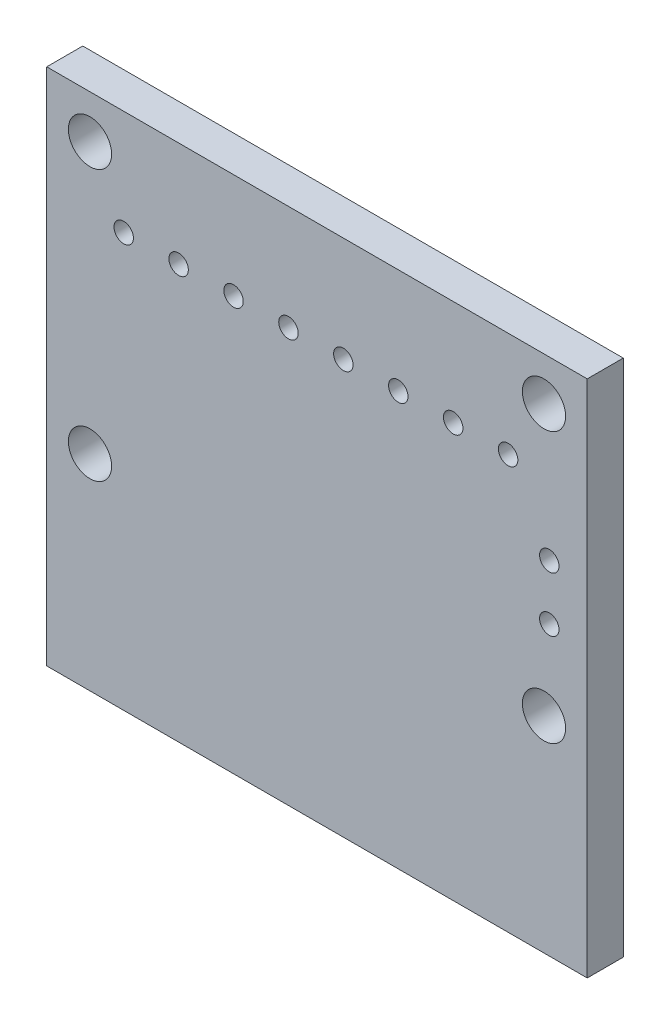
ISO-10303-21;
HEADER;
FILE_DESCRIPTION(('STEP AP214'),'2;1');
FILE_NAME('part.step','',(''),(''),'','','');
FILE_SCHEMA(('AUTOMOTIVE_DESIGN { 1 0 10303 214 1 1 1 1 }'));
ENDSEC;
DATA;
#1=APPLICATION_CONTEXT('core data for automotive mechanical design processes');
#2=APPLICATION_PROTOCOL_DEFINITION('international standard','automotive_design',2000,#1);
#3=PRODUCT_CONTEXT('',#1,'mechanical');
#4=PRODUCT('Part','Part','',(#3));
#5=PRODUCT_RELATED_PRODUCT_CATEGORY('part','',(#4));
#6=PRODUCT_DEFINITION_FORMATION('','',#4);
#7=PRODUCT_DEFINITION_CONTEXT('part definition',#1,'design');
#8=PRODUCT_DEFINITION('design','',#6,#7);
#9=PRODUCT_DEFINITION_SHAPE('','',#8);
#10=(LENGTH_UNIT() NAMED_UNIT(*) SI_UNIT(.MILLI.,.METRE.));
#11=(NAMED_UNIT(*) PLANE_ANGLE_UNIT() SI_UNIT($,.RADIAN.));
#12=(NAMED_UNIT(*) SI_UNIT($,.STERADIAN.) SOLID_ANGLE_UNIT());
#13=UNCERTAINTY_MEASURE_WITH_UNIT(LENGTH_MEASURE(1.E-05),#10,'distance_accuracy_value','');
#14=(GEOMETRIC_REPRESENTATION_CONTEXT(3) GLOBAL_UNCERTAINTY_ASSIGNED_CONTEXT((#13)) GLOBAL_UNIT_ASSIGNED_CONTEXT((#10,
#11,#12)) REPRESENTATION_CONTEXT('',''));
#15=CARTESIAN_POINT('',(0.,0.,0.));
#16=DIRECTION('',(0.,0.,1.));
#17=DIRECTION('',(1.,0.,0.));
#18=AXIS2_PLACEMENT_3D('',#15,#16,#17);
#19=CARTESIAN_POINT('',(31.9999995,37.5000012,1.66624));
#20=DIRECTION('',(0.,0.,-1.));
#21=DIRECTION('',(-1.,0.,0.));
#22=AXIS2_PLACEMENT_3D('',#19,#20,#21);
#23=PLANE('',#22);
#24=CARTESIAN_POINT('',(54.9999916,59.500008,1.66624));
#25=DIRECTION('',(0.,0.,-1.));
#26=DIRECTION('',(-1.,0.,0.));
#27=AXIS2_PLACEMENT_3D('',#24,#25,#26);
#28=CIRCLE('',#27,1.00000054);
#29=CARTESIAN_POINT('',(53.99999106,59.500008,1.66624));
#30=VERTEX_POINT('',#29);
#31=EDGE_CURVE('E120',#30,#30,#28,.T.);
#32=ORIENTED_EDGE('',*,*,#31,.T.);
#33=EDGE_LOOP('',(#32));
#34=FACE_BOUND('',#33,.T.);
#35=CARTESIAN_POINT('',(53.34,56.642,1.66624));
#36=DIRECTION('',(0.,0.,-1.));
#37=DIRECTION('',(-1.,0.,0.));
#38=AXIS2_PLACEMENT_3D('',#35,#36,#37);
#39=CIRCLE('',#38,0.4499991);
#40=CARTESIAN_POINT('',(52.8900009,56.642,1.66624));
#41=VERTEX_POINT('',#40);
#42=EDGE_CURVE('E124',#41,#41,#39,.T.);
#43=ORIENTED_EDGE('',*,*,#42,.T.);
#44=EDGE_LOOP('',(#43));
#45=FACE_BOUND('',#44,.T.);
#46=CARTESIAN_POINT('',(48.26,56.642,1.66624));
#47=DIRECTION('',(0.,0.,-1.));
#48=DIRECTION('',(-1.,0.,0.));
#49=AXIS2_PLACEMENT_3D('',#46,#47,#48);
#50=CIRCLE('',#49,0.4499991);
#51=CARTESIAN_POINT('',(47.8100009,56.642,1.66624));
#52=VERTEX_POINT('',#51);
#53=EDGE_CURVE('E127',#52,#52,#50,.T.);
#54=ORIENTED_EDGE('',*,*,#53,.T.);
#55=EDGE_LOOP('',(#54));
#56=FACE_BOUND('',#55,.T.);
#57=CARTESIAN_POINT('',(50.8,56.642,1.66624));
#58=DIRECTION('',(0.,0.,-1.));
#59=DIRECTION('',(-1.,0.,0.));
#60=AXIS2_PLACEMENT_3D('',#57,#58,#59);
#61=CIRCLE('',#60,0.4499991);
#62=CARTESIAN_POINT('',(50.3500009,56.642,1.66624));
#63=VERTEX_POINT('',#62);
#64=EDGE_CURVE('E130',#63,#63,#61,.T.);
#65=ORIENTED_EDGE('',*,*,#64,.T.);
#66=EDGE_LOOP('',(#65));
#67=FACE_BOUND('',#66,.T.);
#68=CARTESIAN_POINT('',(55.245,50.8,1.66624));
#69=DIRECTION('',(0.,0.,-1.));
#70=DIRECTION('',(-1.,0.,0.));
#71=AXIS2_PLACEMENT_3D('',#68,#69,#70);
#72=CIRCLE('',#71,0.4499991);
#73=CARTESIAN_POINT('',(54.7950009,50.8,1.66624));
#74=VERTEX_POINT('',#73);
#75=EDGE_CURVE('E133',#74,#74,#72,.T.);
#76=ORIENTED_EDGE('',*,*,#75,.T.);
#77=EDGE_LOOP('',(#76));
#78=FACE_BOUND('',#77,.T.);
#79=CARTESIAN_POINT('',(54.9999916,47.0000076,1.66624));
#80=DIRECTION('',(0.,0.,-1.));
#81=DIRECTION('',(-1.,0.,0.));
#82=AXIS2_PLACEMENT_3D('',#79,#80,#81);
#83=CIRCLE('',#82,1.00000054);
#84=CARTESIAN_POINT('',(53.99999106,47.0000076,1.66624));
#85=VERTEX_POINT('',#84);
#86=EDGE_CURVE('E136',#85,#85,#83,.T.);
#87=ORIENTED_EDGE('',*,*,#86,.T.);
#88=EDGE_LOOP('',(#87));
#89=FACE_BOUND('',#88,.T.);
#90=CARTESIAN_POINT('',(55.245,53.34,1.66624));
#91=DIRECTION('',(0.,0.,-1.));
#92=DIRECTION('',(-1.,0.,0.));
#93=AXIS2_PLACEMENT_3D('',#90,#91,#92);
#94=CIRCLE('',#93,0.4499991);
#95=CARTESIAN_POINT('',(54.7950009,53.34,1.66624));
#96=VERTEX_POINT('',#95);
#97=EDGE_CURVE('E139',#96,#96,#94,.T.);
#98=ORIENTED_EDGE('',*,*,#97,.T.);
#99=EDGE_LOOP('',(#98));
#100=FACE_BOUND('',#99,.T.);
#101=CARTESIAN_POINT('',(43.18,56.642,1.66624));
#102=DIRECTION('',(0.,0.,-1.));
#103=DIRECTION('',(-1.,0.,0.));
#104=AXIS2_PLACEMENT_3D('',#101,#102,#103);
#105=CIRCLE('',#104,0.4499991);
#106=CARTESIAN_POINT('',(42.7300009,56.642,1.66624));
#107=VERTEX_POINT('',#106);
#108=EDGE_CURVE('E142',#107,#107,#105,.T.);
#109=ORIENTED_EDGE('',*,*,#108,.T.);
#110=EDGE_LOOP('',(#109));
#111=FACE_BOUND('',#110,.T.);
#112=CARTESIAN_POINT('',(45.72,56.642,1.66624));
#113=DIRECTION('',(0.,0.,-1.));
#114=DIRECTION('',(-1.,0.,0.));
#115=AXIS2_PLACEMENT_3D('',#112,#113,#114);
#116=CIRCLE('',#115,0.4499991);
#117=CARTESIAN_POINT('',(45.2700009,56.642,1.66624));
#118=VERTEX_POINT('',#117);
#119=EDGE_CURVE('E145',#118,#118,#116,.T.);
#120=ORIENTED_EDGE('',*,*,#119,.T.);
#121=EDGE_LOOP('',(#120));
#122=FACE_BOUND('',#121,.T.);
#123=CARTESIAN_POINT('',(33.9999828,59.500008,1.66624));
#124=DIRECTION('',(0.,0.,-1.));
#125=DIRECTION('',(-1.,0.,0.));
#126=AXIS2_PLACEMENT_3D('',#123,#124,#125);
#127=CIRCLE('',#126,1.00000054);
#128=CARTESIAN_POINT('',(32.99998226,59.500008,1.66624));
#129=VERTEX_POINT('',#128);
#130=EDGE_CURVE('E148',#129,#129,#127,.T.);
#131=ORIENTED_EDGE('',*,*,#130,.T.);
#132=EDGE_LOOP('',(#131));
#133=FACE_BOUND('',#132,.T.);
#134=CARTESIAN_POINT('',(40.64,56.642,1.66624));
#135=DIRECTION('',(0.,0.,-1.));
#136=DIRECTION('',(-1.,0.,0.));
#137=AXIS2_PLACEMENT_3D('',#134,#135,#136);
#138=CIRCLE('',#137,0.4499991);
#139=CARTESIAN_POINT('',(40.1900009,56.642,1.66624));
#140=VERTEX_POINT('',#139);
#141=EDGE_CURVE('E151',#140,#140,#138,.T.);
#142=ORIENTED_EDGE('',*,*,#141,.T.);
#143=EDGE_LOOP('',(#142));
#144=FACE_BOUND('',#143,.T.);
#145=CARTESIAN_POINT('',(35.56,56.642,1.66624));
#146=DIRECTION('',(0.,0.,-1.));
#147=DIRECTION('',(-1.,0.,0.));
#148=AXIS2_PLACEMENT_3D('',#145,#146,#147);
#149=CIRCLE('',#148,0.4499991);
#150=CARTESIAN_POINT('',(35.1100009,56.642,1.66624));
#151=VERTEX_POINT('',#150);
#152=EDGE_CURVE('E154',#151,#151,#149,.T.);
#153=ORIENTED_EDGE('',*,*,#152,.T.);
#154=EDGE_LOOP('',(#153));
#155=FACE_BOUND('',#154,.T.);
#156=CARTESIAN_POINT('',(38.1,56.642,1.66624));
#157=DIRECTION('',(0.,0.,-1.));
#158=DIRECTION('',(-1.,0.,0.));
#159=AXIS2_PLACEMENT_3D('',#156,#157,#158);
#160=CIRCLE('',#159,0.4499991);
#161=CARTESIAN_POINT('',(37.6500009,56.642,1.66624));
#162=VERTEX_POINT('',#161);
#163=EDGE_CURVE('E156',#162,#162,#160,.T.);
#164=ORIENTED_EDGE('',*,*,#163,.T.);
#165=EDGE_LOOP('',(#164));
#166=FACE_BOUND('',#165,.T.);
#167=CARTESIAN_POINT('',(33.9999828,47.0000076,1.66624));
#168=DIRECTION('',(0.,0.,-1.));
#169=DIRECTION('',(-1.,0.,0.));
#170=AXIS2_PLACEMENT_3D('',#167,#168,#169);
#171=CIRCLE('',#170,1.00000054);
#172=CARTESIAN_POINT('',(32.99998226,47.0000076,1.66624));
#173=VERTEX_POINT('',#172);
#174=EDGE_CURVE('E19',#173,#173,#171,.T.);
#175=ORIENTED_EDGE('',*,*,#174,.T.);
#176=EDGE_LOOP('',(#175));
#177=FACE_BOUND('',#176,.T.);
#178=DIRECTION('',(0.,1.,0.));
#179=VECTOR('',#178,1.);
#180=CARTESIAN_POINT('',(57.0000003,37.5000012,1.66624));
#181=LINE('',#180,#179);
#182=CARTESIAN_POINT('',(57.0000003,37.5000012,1.66624));
#183=VERTEX_POINT('',#182);
#184=CARTESIAN_POINT('',(57.0000003,61.49999892,1.66624));
#185=VERTEX_POINT('',#184);
#186=EDGE_CURVE('E54',#183,#185,#181,.T.);
#187=ORIENTED_EDGE('',*,*,#186,.T.);
#188=DIRECTION('',(1.,0.,0.));
#189=VECTOR('',#188,1.);
#190=CARTESIAN_POINT('',(57.0000003,61.49999892,1.66624));
#191=LINE('',#190,#189);
#192=CARTESIAN_POINT('',(31.9999995,61.49999892,1.66624));
#193=VERTEX_POINT('',#192);
#194=EDGE_CURVE('E56',#185,#193,#191,.F.);
#195=ORIENTED_EDGE('',*,*,#194,.T.);
#196=DIRECTION('',(0.,1.,0.));
#197=VECTOR('',#196,1.);
#198=CARTESIAN_POINT('',(31.9999995,61.49999892,1.66624));
#199=LINE('',#198,#197);
#200=CARTESIAN_POINT('',(31.9999995,37.5000012,1.66624));
#201=VERTEX_POINT('',#200);
#202=EDGE_CURVE('E58',#193,#201,#199,.F.);
#203=ORIENTED_EDGE('',*,*,#202,.T.);
#204=DIRECTION('',(1.,0.,0.));
#205=VECTOR('',#204,1.);
#206=CARTESIAN_POINT('',(31.9999995,37.5000012,1.66624));
#207=LINE('',#206,#205);
#208=EDGE_CURVE('E163',#201,#183,#207,.T.);
#209=ORIENTED_EDGE('',*,*,#208,.T.);
#210=EDGE_LOOP('',(#187,#195,#203,#209));
#211=FACE_BOUND('',#210,.T.);
#212=ADVANCED_FACE('F16',(#34,#45,#56,#67,#78,#89,#100,#111,#122,#133,#144,#155,#166,#177,#211),
#23,.F.);
#213=CARTESIAN_POINT('',(31.9999995,61.49999892,0.));
#214=DIRECTION('',(1.,0.,0.));
#215=DIRECTION('',(0.,0.,-1.));
#216=AXIS2_PLACEMENT_3D('',#213,#214,#215);
#217=PLANE('',#216);
#218=DIRECTION('',(0.,0.,1.));
#219=VECTOR('',#218,1.);
#220=CARTESIAN_POINT('',(31.9999995,37.5000012,0.));
#221=LINE('',#220,#219);
#222=CARTESIAN_POINT('',(31.9999995,37.5000012,0.));
#223=VERTEX_POINT('',#222);
#224=EDGE_CURVE('E69',#223,#201,#221,.T.);
#225=ORIENTED_EDGE('',*,*,#224,.T.);
#226=ORIENTED_EDGE('',*,*,#202,.F.);
#227=DIRECTION('',(0.,0.,-1.));
#228=VECTOR('',#227,1.);
#229=CARTESIAN_POINT('',(31.9999995,61.49999892,0.));
#230=LINE('',#229,#228);
#231=CARTESIAN_POINT('',(31.9999995,61.49999892,0.));
#232=VERTEX_POINT('',#231);
#233=EDGE_CURVE('E63',#193,#232,#230,.T.);
#234=ORIENTED_EDGE('',*,*,#233,.T.);
#235=DIRECTION('',(0.,1.,0.));
#236=VECTOR('',#235,1.);
#237=CARTESIAN_POINT('',(31.9999995,37.5000012,0.));
#238=LINE('',#237,#236);
#239=EDGE_CURVE('E123',#223,#232,#238,.T.);
#240=ORIENTED_EDGE('',*,*,#239,.F.);
#241=EDGE_LOOP('',(#225,#226,#234,#240));
#242=FACE_BOUND('',#241,.T.);
#243=ADVANCED_FACE('F66',(#242),#217,.F.);
#244=CARTESIAN_POINT('',(57.0000003,61.49999892,0.));
#245=DIRECTION('',(0.,-1.,0.));
#246=DIRECTION('',(0.,0.,-1.));
#247=AXIS2_PLACEMENT_3D('',#244,#245,#246);
#248=PLANE('',#247);
#249=ORIENTED_EDGE('',*,*,#233,.F.);
#250=ORIENTED_EDGE('',*,*,#194,.F.);
#251=DIRECTION('',(0.,0.,1.));
#252=VECTOR('',#251,1.);
#253=CARTESIAN_POINT('',(57.0000003,61.49999892,0.));
#254=LINE('',#253,#252);
#255=CARTESIAN_POINT('',(57.0000003,61.49999892,0.));
#256=VERTEX_POINT('',#255);
#257=EDGE_CURVE('E77',#185,#256,#254,.F.);
#258=ORIENTED_EDGE('',*,*,#257,.T.);
#259=DIRECTION('',(-1.,0.,0.));
#260=VECTOR('',#259,1.);
#261=CARTESIAN_POINT('',(31.9999995,61.49999892,0.));
#262=LINE('',#261,#260);
#263=EDGE_CURVE('E74',#232,#256,#262,.F.);
#264=ORIENTED_EDGE('',*,*,#263,.F.);
#265=EDGE_LOOP('',(#249,#250,#258,#264));
#266=FACE_BOUND('',#265,.T.);
#267=ADVANCED_FACE('F72',(#266),#248,.F.);
#268=CARTESIAN_POINT('',(57.0000003,37.5000012,0.));
#269=DIRECTION('',(-1.,0.,0.));
#270=DIRECTION('',(0.,0.,1.));
#271=AXIS2_PLACEMENT_3D('',#268,#269,#270);
#272=PLANE('',#271);
#273=ORIENTED_EDGE('',*,*,#257,.F.);
#274=ORIENTED_EDGE('',*,*,#186,.F.);
#275=DIRECTION('',(0.,0.,1.));
#276=VECTOR('',#275,1.);
#277=CARTESIAN_POINT('',(57.0000003,37.5000012,0.));
#278=LINE('',#277,#276);
#279=CARTESIAN_POINT('',(57.0000003,37.5000012,0.));
#280=VERTEX_POINT('',#279);
#281=EDGE_CURVE('E34',#183,#280,#278,.F.);
#282=ORIENTED_EDGE('',*,*,#281,.T.);
#283=DIRECTION('',(0.,1.,0.));
#284=VECTOR('',#283,1.);
#285=CARTESIAN_POINT('',(57.0000003,37.5000012,0.));
#286=LINE('',#285,#284);
#287=EDGE_CURVE('E170',#256,#280,#286,.F.);
#288=ORIENTED_EDGE('',*,*,#287,.F.);
#289=EDGE_LOOP('',(#273,#274,#282,#288));
#290=FACE_BOUND('',#289,.T.);
#291=ADVANCED_FACE('F171',(#290),#272,.F.);
#292=CARTESIAN_POINT('',(31.9999995,37.5000012,0.));
#293=DIRECTION('',(0.,1.,0.));
#294=DIRECTION('',(0.,0.,1.));
#295=AXIS2_PLACEMENT_3D('',#292,#293,#294);
#296=PLANE('',#295);
#297=ORIENTED_EDGE('',*,*,#281,.F.);
#298=ORIENTED_EDGE('',*,*,#208,.F.);
#299=ORIENTED_EDGE('',*,*,#224,.F.);
#300=DIRECTION('',(-1.,0.,0.));
#301=VECTOR('',#300,1.);
#302=CARTESIAN_POINT('',(31.9999995,37.5000012,0.));
#303=LINE('',#302,#301);
#304=EDGE_CURVE('E119',#280,#223,#303,.T.);
#305=ORIENTED_EDGE('',*,*,#304,.F.);
#306=EDGE_LOOP('',(#297,#298,#299,#305));
#307=FACE_BOUND('',#306,.T.);
#308=ADVANCED_FACE('F178',(#307),#296,.F.);
#309=CARTESIAN_POINT('',(33.9999828,47.0000076,0.));
#310=DIRECTION('',(0.,0.,-1.));
#311=DIRECTION('',(-1.,0.,0.));
#312=AXIS2_PLACEMENT_3D('',#309,#310,#311);
#313=CYLINDRICAL_SURFACE('',#312,1.00000054);
#314=ORIENTED_EDGE('',*,*,#174,.F.);
#315=EDGE_LOOP('',(#314));
#316=FACE_BOUND('',#315,.T.);
#317=CARTESIAN_POINT('',(33.9999828,47.0000076,0.));
#318=DIRECTION('',(0.,0.,-1.));
#319=DIRECTION('',(-1.,0.,0.));
#320=AXIS2_PLACEMENT_3D('',#317,#318,#319);
#321=CIRCLE('',#320,1.00000054);
#322=CARTESIAN_POINT('',(32.99998226,47.0000076,0.));
#323=VERTEX_POINT('',#322);
#324=EDGE_CURVE('E116',#323,#323,#321,.F.);
#325=ORIENTED_EDGE('',*,*,#324,.F.);
#326=EDGE_LOOP('',(#325));
#327=FACE_BOUND('',#326,.T.);
#328=ADVANCED_FACE('F180',(#316,#327),#313,.F.);
#329=CARTESIAN_POINT('',(38.1,56.642,0.));
#330=DIRECTION('',(0.,0.,-1.));
#331=DIRECTION('',(-1.,0.,0.));
#332=AXIS2_PLACEMENT_3D('',#329,#330,#331);
#333=CYLINDRICAL_SURFACE('',#332,0.4499991);
#334=ORIENTED_EDGE('',*,*,#163,.F.);
#335=EDGE_LOOP('',(#334));
#336=FACE_BOUND('',#335,.T.);
#337=CARTESIAN_POINT('',(38.1,56.642,0.));
#338=DIRECTION('',(0.,0.,-1.));
#339=DIRECTION('',(-1.,0.,0.));
#340=AXIS2_PLACEMENT_3D('',#337,#338,#339);
#341=CIRCLE('',#340,0.4499991);
#342=CARTESIAN_POINT('',(37.6500009,56.642,0.));
#343=VERTEX_POINT('',#342);
#344=EDGE_CURVE('E113',#343,#343,#341,.F.);
#345=ORIENTED_EDGE('',*,*,#344,.F.);
#346=EDGE_LOOP('',(#345));
#347=FACE_BOUND('',#346,.T.);
#348=ADVANCED_FACE('F187',(#336,#347),#333,.F.);
#349=CARTESIAN_POINT('',(35.56,56.642,0.));
#350=DIRECTION('',(0.,0.,-1.));
#351=DIRECTION('',(-1.,0.,0.));
#352=AXIS2_PLACEMENT_3D('',#349,#350,#351);
#353=CYLINDRICAL_SURFACE('',#352,0.4499991);
#354=ORIENTED_EDGE('',*,*,#152,.F.);
#355=EDGE_LOOP('',(#354));
#356=FACE_BOUND('',#355,.T.);
#357=CARTESIAN_POINT('',(35.56,56.642,0.));
#358=DIRECTION('',(0.,0.,-1.));
#359=DIRECTION('',(-1.,0.,0.));
#360=AXIS2_PLACEMENT_3D('',#357,#358,#359);
#361=CIRCLE('',#360,0.4499991);
#362=CARTESIAN_POINT('',(35.1100009,56.642,0.));
#363=VERTEX_POINT('',#362);
#364=EDGE_CURVE('E110',#363,#363,#361,.F.);
#365=ORIENTED_EDGE('',*,*,#364,.F.);
#366=EDGE_LOOP('',(#365));
#367=FACE_BOUND('',#366,.T.);
#368=ADVANCED_FACE('F241',(#356,#367),#353,.F.);
#369=CARTESIAN_POINT('',(40.64,56.642,0.));
#370=DIRECTION('',(0.,0.,-1.));
#371=DIRECTION('',(-1.,0.,0.));
#372=AXIS2_PLACEMENT_3D('',#369,#370,#371);
#373=CYLINDRICAL_SURFACE('',#372,0.4499991);
#374=ORIENTED_EDGE('',*,*,#141,.F.);
#375=EDGE_LOOP('',(#374));
#376=FACE_BOUND('',#375,.T.);
#377=CARTESIAN_POINT('',(40.64,56.642,0.));
#378=DIRECTION('',(0.,0.,-1.));
#379=DIRECTION('',(-1.,0.,0.));
#380=AXIS2_PLACEMENT_3D('',#377,#378,#379);
#381=CIRCLE('',#380,0.4499991);
#382=CARTESIAN_POINT('',(40.1900009,56.642,0.));
#383=VERTEX_POINT('',#382);
#384=EDGE_CURVE('E107',#383,#383,#381,.F.);
#385=ORIENTED_EDGE('',*,*,#384,.F.);
#386=EDGE_LOOP('',(#385));
#387=FACE_BOUND('',#386,.T.);
#388=ADVANCED_FACE('F237',(#376,#387),#373,.F.);
#389=CARTESIAN_POINT('',(33.9999828,59.500008,0.));
#390=DIRECTION('',(0.,0.,-1.));
#391=DIRECTION('',(-1.,0.,0.));
#392=AXIS2_PLACEMENT_3D('',#389,#390,#391);
#393=CYLINDRICAL_SURFACE('',#392,1.00000054);
#394=ORIENTED_EDGE('',*,*,#130,.F.);
#395=EDGE_LOOP('',(#394));
#396=FACE_BOUND('',#395,.T.);
#397=CARTESIAN_POINT('',(33.9999828,59.500008,0.));
#398=DIRECTION('',(0.,0.,-1.));
#399=DIRECTION('',(-1.,0.,0.));
#400=AXIS2_PLACEMENT_3D('',#397,#398,#399);
#401=CIRCLE('',#400,1.00000054);
#402=CARTESIAN_POINT('',(32.99998226,59.500008,0.));
#403=VERTEX_POINT('',#402);
#404=EDGE_CURVE('E104',#403,#403,#401,.F.);
#405=ORIENTED_EDGE('',*,*,#404,.F.);
#406=EDGE_LOOP('',(#405));
#407=FACE_BOUND('',#406,.T.);
#408=ADVANCED_FACE('F233',(#396,#407),#393,.F.);
#409=CARTESIAN_POINT('',(45.72,56.642,0.));
#410=DIRECTION('',(0.,0.,-1.));
#411=DIRECTION('',(-1.,0.,0.));
#412=AXIS2_PLACEMENT_3D('',#409,#410,#411);
#413=CYLINDRICAL_SURFACE('',#412,0.4499991);
#414=ORIENTED_EDGE('',*,*,#119,.F.);
#415=EDGE_LOOP('',(#414));
#416=FACE_BOUND('',#415,.T.);
#417=CARTESIAN_POINT('',(45.72,56.642,0.));
#418=DIRECTION('',(0.,0.,-1.));
#419=DIRECTION('',(-1.,0.,0.));
#420=AXIS2_PLACEMENT_3D('',#417,#418,#419);
#421=CIRCLE('',#420,0.4499991);
#422=CARTESIAN_POINT('',(45.2700009,56.642,0.));
#423=VERTEX_POINT('',#422);
#424=EDGE_CURVE('E101',#423,#423,#421,.F.);
#425=ORIENTED_EDGE('',*,*,#424,.F.);
#426=EDGE_LOOP('',(#425));
#427=FACE_BOUND('',#426,.T.);
#428=ADVANCED_FACE('F229',(#416,#427),#413,.F.);
#429=CARTESIAN_POINT('',(43.18,56.642,0.));
#430=DIRECTION('',(0.,0.,-1.));
#431=DIRECTION('',(-1.,0.,0.));
#432=AXIS2_PLACEMENT_3D('',#429,#430,#431);
#433=CYLINDRICAL_SURFACE('',#432,0.4499991);
#434=ORIENTED_EDGE('',*,*,#108,.F.);
#435=EDGE_LOOP('',(#434));
#436=FACE_BOUND('',#435,.T.);
#437=CARTESIAN_POINT('',(43.18,56.642,0.));
#438=DIRECTION('',(0.,0.,-1.));
#439=DIRECTION('',(-1.,0.,0.));
#440=AXIS2_PLACEMENT_3D('',#437,#438,#439);
#441=CIRCLE('',#440,0.4499991);
#442=CARTESIAN_POINT('',(42.7300009,56.642,0.));
#443=VERTEX_POINT('',#442);
#444=EDGE_CURVE('E98',#443,#443,#441,.F.);
#445=ORIENTED_EDGE('',*,*,#444,.F.);
#446=EDGE_LOOP('',(#445));
#447=FACE_BOUND('',#446,.T.);
#448=ADVANCED_FACE('F225',(#436,#447),#433,.F.);
#449=CARTESIAN_POINT('',(55.245,53.34,0.));
#450=DIRECTION('',(0.,0.,-1.));
#451=DIRECTION('',(-1.,0.,0.));
#452=AXIS2_PLACEMENT_3D('',#449,#450,#451);
#453=CYLINDRICAL_SURFACE('',#452,0.4499991);
#454=ORIENTED_EDGE('',*,*,#97,.F.);
#455=EDGE_LOOP('',(#454));
#456=FACE_BOUND('',#455,.T.);
#457=CARTESIAN_POINT('',(55.245,53.34,0.));
#458=DIRECTION('',(0.,0.,-1.));
#459=DIRECTION('',(-1.,0.,0.));
#460=AXIS2_PLACEMENT_3D('',#457,#458,#459);
#461=CIRCLE('',#460,0.4499991);
#462=CARTESIAN_POINT('',(54.7950009,53.34,0.));
#463=VERTEX_POINT('',#462);
#464=EDGE_CURVE('E95',#463,#463,#461,.F.);
#465=ORIENTED_EDGE('',*,*,#464,.F.);
#466=EDGE_LOOP('',(#465));
#467=FACE_BOUND('',#466,.T.);
#468=ADVANCED_FACE('F221',(#456,#467),#453,.F.);
#469=CARTESIAN_POINT('',(54.9999916,47.0000076,0.));
#470=DIRECTION('',(0.,0.,-1.));
#471=DIRECTION('',(-1.,0.,0.));
#472=AXIS2_PLACEMENT_3D('',#469,#470,#471);
#473=CYLINDRICAL_SURFACE('',#472,1.00000054);
#474=ORIENTED_EDGE('',*,*,#86,.F.);
#475=EDGE_LOOP('',(#474));
#476=FACE_BOUND('',#475,.T.);
#477=CARTESIAN_POINT('',(54.9999916,47.0000076,0.));
#478=DIRECTION('',(0.,0.,-1.));
#479=DIRECTION('',(-1.,0.,0.));
#480=AXIS2_PLACEMENT_3D('',#477,#478,#479);
#481=CIRCLE('',#480,1.00000054);
#482=CARTESIAN_POINT('',(53.99999106,47.0000076,0.));
#483=VERTEX_POINT('',#482);
#484=EDGE_CURVE('E92',#483,#483,#481,.F.);
#485=ORIENTED_EDGE('',*,*,#484,.F.);
#486=EDGE_LOOP('',(#485));
#487=FACE_BOUND('',#486,.T.);
#488=ADVANCED_FACE('F217',(#476,#487),#473,.F.);
#489=CARTESIAN_POINT('',(55.245,50.8,0.));
#490=DIRECTION('',(0.,0.,-1.));
#491=DIRECTION('',(-1.,0.,0.));
#492=AXIS2_PLACEMENT_3D('',#489,#490,#491);
#493=CYLINDRICAL_SURFACE('',#492,0.4499991);
#494=ORIENTED_EDGE('',*,*,#75,.F.);
#495=EDGE_LOOP('',(#494));
#496=FACE_BOUND('',#495,.T.);
#497=CARTESIAN_POINT('',(55.245,50.8,0.));
#498=DIRECTION('',(0.,0.,-1.));
#499=DIRECTION('',(-1.,0.,0.));
#500=AXIS2_PLACEMENT_3D('',#497,#498,#499);
#501=CIRCLE('',#500,0.4499991);
#502=CARTESIAN_POINT('',(54.7950009,50.8,0.));
#503=VERTEX_POINT('',#502);
#504=EDGE_CURVE('E89',#503,#503,#501,.F.);
#505=ORIENTED_EDGE('',*,*,#504,.F.);
#506=EDGE_LOOP('',(#505));
#507=FACE_BOUND('',#506,.T.);
#508=ADVANCED_FACE('F213',(#496,#507),#493,.F.);
#509=CARTESIAN_POINT('',(50.8,56.642,0.));
#510=DIRECTION('',(0.,0.,-1.));
#511=DIRECTION('',(-1.,0.,0.));
#512=AXIS2_PLACEMENT_3D('',#509,#510,#511);
#513=CYLINDRICAL_SURFACE('',#512,0.4499991);
#514=ORIENTED_EDGE('',*,*,#64,.F.);
#515=EDGE_LOOP('',(#514));
#516=FACE_BOUND('',#515,.T.);
#517=CARTESIAN_POINT('',(50.8,56.642,0.));
#518=DIRECTION('',(0.,0.,-1.));
#519=DIRECTION('',(-1.,0.,0.));
#520=AXIS2_PLACEMENT_3D('',#517,#518,#519);
#521=CIRCLE('',#520,0.4499991);
#522=CARTESIAN_POINT('',(50.3500009,56.642,0.));
#523=VERTEX_POINT('',#522);
#524=EDGE_CURVE('E86',#523,#523,#521,.F.);
#525=ORIENTED_EDGE('',*,*,#524,.F.);
#526=EDGE_LOOP('',(#525));
#527=FACE_BOUND('',#526,.T.);
#528=ADVANCED_FACE('F209',(#516,#527),#513,.F.);
#529=CARTESIAN_POINT('',(48.26,56.642,0.));
#530=DIRECTION('',(0.,0.,-1.));
#531=DIRECTION('',(-1.,0.,0.));
#532=AXIS2_PLACEMENT_3D('',#529,#530,#531);
#533=CYLINDRICAL_SURFACE('',#532,0.4499991);
#534=ORIENTED_EDGE('',*,*,#53,.F.);
#535=EDGE_LOOP('',(#534));
#536=FACE_BOUND('',#535,.T.);
#537=CARTESIAN_POINT('',(48.26,56.642,0.));
#538=DIRECTION('',(0.,0.,-1.));
#539=DIRECTION('',(-1.,0.,0.));
#540=AXIS2_PLACEMENT_3D('',#537,#538,#539);
#541=CIRCLE('',#540,0.4499991);
#542=CARTESIAN_POINT('',(47.8100009,56.642,0.));
#543=VERTEX_POINT('',#542);
#544=EDGE_CURVE('E83',#543,#543,#541,.F.);
#545=ORIENTED_EDGE('',*,*,#544,.F.);
#546=EDGE_LOOP('',(#545));
#547=FACE_BOUND('',#546,.T.);
#548=ADVANCED_FACE('F205',(#536,#547),#533,.F.);
#549=CARTESIAN_POINT('',(53.34,56.642,0.));
#550=DIRECTION('',(0.,0.,-1.));
#551=DIRECTION('',(-1.,0.,0.));
#552=AXIS2_PLACEMENT_3D('',#549,#550,#551);
#553=CYLINDRICAL_SURFACE('',#552,0.4499991);
#554=ORIENTED_EDGE('',*,*,#42,.F.);
#555=EDGE_LOOP('',(#554));
#556=FACE_BOUND('',#555,.T.);
#557=CARTESIAN_POINT('',(53.34,56.642,0.));
#558=DIRECTION('',(0.,0.,-1.));
#559=DIRECTION('',(-1.,0.,0.));
#560=AXIS2_PLACEMENT_3D('',#557,#558,#559);
#561=CIRCLE('',#560,0.4499991);
#562=CARTESIAN_POINT('',(52.8900009,56.642,0.));
#563=VERTEX_POINT('',#562);
#564=EDGE_CURVE('E25',#563,#563,#561,.F.);
#565=ORIENTED_EDGE('',*,*,#564,.F.);
#566=EDGE_LOOP('',(#565));
#567=FACE_BOUND('',#566,.T.);
#568=ADVANCED_FACE('F198',(#556,#567),#553,.F.);
#569=CARTESIAN_POINT('',(54.9999916,59.500008,0.));
#570=DIRECTION('',(0.,0.,-1.));
#571=DIRECTION('',(-1.,0.,0.));
#572=AXIS2_PLACEMENT_3D('',#569,#570,#571);
#573=CYLINDRICAL_SURFACE('',#572,1.00000054);
#574=ORIENTED_EDGE('',*,*,#31,.F.);
#575=EDGE_LOOP('',(#574));
#576=FACE_BOUND('',#575,.T.);
#577=CARTESIAN_POINT('',(54.9999916,59.500008,0.));
#578=DIRECTION('',(0.,0.,-1.));
#579=DIRECTION('',(-1.,0.,0.));
#580=AXIS2_PLACEMENT_3D('',#577,#578,#579);
#581=CIRCLE('',#580,1.00000054);
#582=CARTESIAN_POINT('',(53.99999106,59.500008,0.));
#583=VERTEX_POINT('',#582);
#584=EDGE_CURVE('E11',#583,#583,#581,.F.);
#585=ORIENTED_EDGE('',*,*,#584,.F.);
#586=EDGE_LOOP('',(#585));
#587=FACE_BOUND('',#586,.T.);
#588=ADVANCED_FACE('F192',(#576,#587),#573,.F.);
#589=CARTESIAN_POINT('',(31.9999995,37.5000012,0.));
#590=DIRECTION('',(0.,0.,-1.));
#591=DIRECTION('',(-1.,0.,0.));
#592=AXIS2_PLACEMENT_3D('',#589,#590,#591);
#593=PLANE('',#592);
#594=ORIENTED_EDGE('',*,*,#584,.T.);
#595=EDGE_LOOP('',(#594));
#596=FACE_BOUND('',#595,.T.);
#597=ORIENTED_EDGE('',*,*,#564,.T.);
#598=EDGE_LOOP('',(#597));
#599=FACE_BOUND('',#598,.T.);
#600=ORIENTED_EDGE('',*,*,#544,.T.);
#601=EDGE_LOOP('',(#600));
#602=FACE_BOUND('',#601,.T.);
#603=ORIENTED_EDGE('',*,*,#524,.T.);
#604=EDGE_LOOP('',(#603));
#605=FACE_BOUND('',#604,.T.);
#606=ORIENTED_EDGE('',*,*,#504,.T.);
#607=EDGE_LOOP('',(#606));
#608=FACE_BOUND('',#607,.T.);
#609=ORIENTED_EDGE('',*,*,#484,.T.);
#610=EDGE_LOOP('',(#609));
#611=FACE_BOUND('',#610,.T.);
#612=ORIENTED_EDGE('',*,*,#464,.T.);
#613=EDGE_LOOP('',(#612));
#614=FACE_BOUND('',#613,.T.);
#615=ORIENTED_EDGE('',*,*,#444,.T.);
#616=EDGE_LOOP('',(#615));
#617=FACE_BOUND('',#616,.T.);
#618=ORIENTED_EDGE('',*,*,#424,.T.);
#619=EDGE_LOOP('',(#618));
#620=FACE_BOUND('',#619,.T.);
#621=ORIENTED_EDGE('',*,*,#404,.T.);
#622=EDGE_LOOP('',(#621));
#623=FACE_BOUND('',#622,.T.);
#624=ORIENTED_EDGE('',*,*,#384,.T.);
#625=EDGE_LOOP('',(#624));
#626=FACE_BOUND('',#625,.T.);
#627=ORIENTED_EDGE('',*,*,#364,.T.);
#628=EDGE_LOOP('',(#627));
#629=FACE_BOUND('',#628,.T.);
#630=ORIENTED_EDGE('',*,*,#344,.T.);
#631=EDGE_LOOP('',(#630));
#632=FACE_BOUND('',#631,.T.);
#633=ORIENTED_EDGE('',*,*,#324,.T.);
#634=EDGE_LOOP('',(#633));
#635=FACE_BOUND('',#634,.T.);
#636=ORIENTED_EDGE('',*,*,#287,.T.);
#637=ORIENTED_EDGE('',*,*,#304,.T.);
#638=ORIENTED_EDGE('',*,*,#239,.T.);
#639=ORIENTED_EDGE('',*,*,#263,.T.);
#640=EDGE_LOOP('',(#636,#637,#638,#639));
#641=FACE_BOUND('',#640,.T.);
#642=ADVANCED_FACE('F175',(#596,#599,#602,#605,#608,#611,#614,#617,#620,#623,#626,#629,#632,
#635,#641),#593,.T.);
#643=CLOSED_SHELL('',(#212,#243,#267,#291,#308,#328,#348,#368,#388,#408,#428,#448,#468,#488,
#508,#528,#548,#568,#588,#642));
#644=MANIFOLD_SOLID_BREP('B1',#643);
#645=ADVANCED_BREP_SHAPE_REPRESENTATION('',(#18,#644),#14);
#646=SHAPE_DEFINITION_REPRESENTATION(#9,#645);
ENDSEC;
END-ISO-10303-21;
